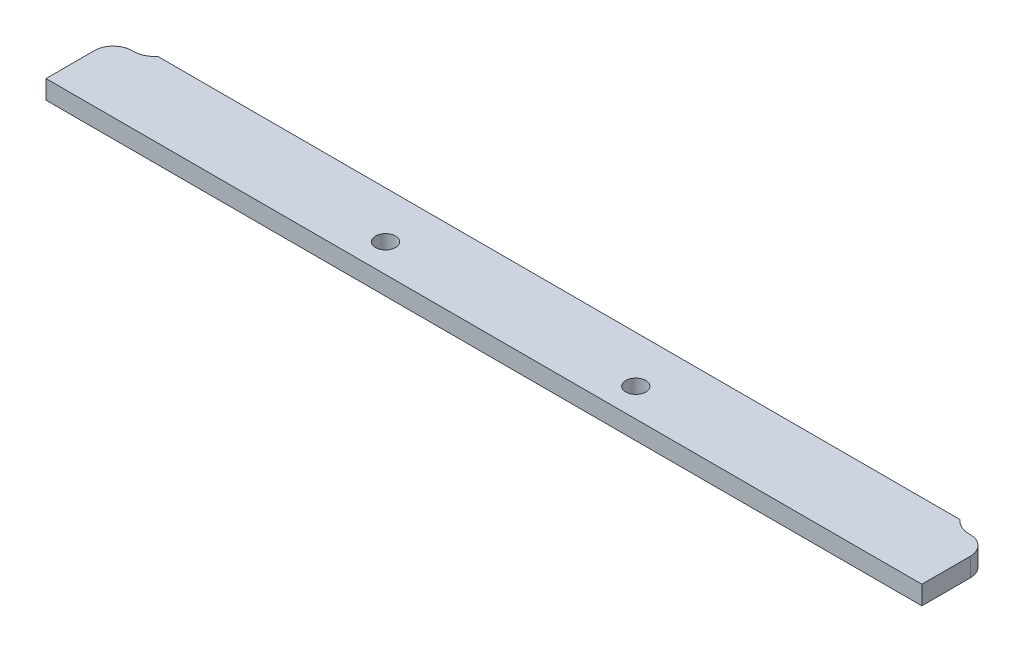
ISO-10303-21;
HEADER;
FILE_DESCRIPTION(('STEP AP214'),'2;1');
FILE_NAME('part.step','',(''),(''),'','','');
FILE_SCHEMA(('AUTOMOTIVE_DESIGN { 1 0 10303 214 1 1 1 1 }'));
ENDSEC;
DATA;
#1=APPLICATION_CONTEXT('core data for automotive mechanical design processes');
#2=APPLICATION_PROTOCOL_DEFINITION('international standard','automotive_design',2000,#1);
#3=PRODUCT_CONTEXT('',#1,'mechanical');
#4=PRODUCT('Part','Part','',(#3));
#5=PRODUCT_RELATED_PRODUCT_CATEGORY('part','',(#4));
#6=PRODUCT_DEFINITION_FORMATION('','',#4);
#7=PRODUCT_DEFINITION_CONTEXT('part definition',#1,'design');
#8=PRODUCT_DEFINITION('design','',#6,#7);
#9=PRODUCT_DEFINITION_SHAPE('','',#8);
#10=(LENGTH_UNIT() NAMED_UNIT(*) SI_UNIT(.MILLI.,.METRE.));
#11=(NAMED_UNIT(*) PLANE_ANGLE_UNIT() SI_UNIT($,.RADIAN.));
#12=(NAMED_UNIT(*) SI_UNIT($,.STERADIAN.) SOLID_ANGLE_UNIT());
#13=UNCERTAINTY_MEASURE_WITH_UNIT(LENGTH_MEASURE(1.E-05),#10,'distance_accuracy_value','');
#14=(GEOMETRIC_REPRESENTATION_CONTEXT(3) GLOBAL_UNCERTAINTY_ASSIGNED_CONTEXT((#13)) GLOBAL_UNIT_ASSIGNED_CONTEXT((#10,
#11,#12)) REPRESENTATION_CONTEXT('',''));
#15=CARTESIAN_POINT('',(0.,0.,0.));
#16=DIRECTION('',(0.,0.,1.));
#17=DIRECTION('',(1.,0.,0.));
#18=AXIS2_PLACEMENT_3D('',#15,#16,#17);
#19=CARTESIAN_POINT('',(-5.43102283706826,0.,-28.5998740388004));
#20=DIRECTION('',(0.,1.,0.));
#21=DIRECTION('',(0.,0.,1.));
#22=AXIS2_PLACEMENT_3D('',#19,#20,#21);
#23=PLANE('',#22);
#24=CARTESIAN_POINT('',(41.1097970990968,0.,-18.9031140667815));
#25=DIRECTION('',(0.,1.,0.));
#26=DIRECTION('',(0.,0.,1.));
#27=AXIS2_PLACEMENT_3D('',#24,#25,#26);
#28=CIRCLE('',#27,1.6);
#29=CARTESIAN_POINT('',(41.1097970990968,0.,-17.3031140667815));
#30=VERTEX_POINT('',#29);
#31=EDGE_CURVE('E254',#30,#30,#28,.F.);
#32=ORIENTED_EDGE('',*,*,#31,.F.);
#33=EDGE_LOOP('',(#32));
#34=FACE_BOUND('',#33,.T.);
#35=CARTESIAN_POINT('',(81.1097970990968,0.,-18.9031140667815));
#36=DIRECTION('',(0.,1.,0.));
#37=DIRECTION('',(0.,0.,1.));
#38=AXIS2_PLACEMENT_3D('',#35,#36,#37);
#39=CIRCLE('',#38,1.6);
#40=CARTESIAN_POINT('',(81.1097970990968,0.,-17.3031140667815));
#41=VERTEX_POINT('',#40);
#42=EDGE_CURVE('E271',#41,#41,#39,.F.);
#43=ORIENTED_EDGE('',*,*,#42,.F.);
#44=EDGE_LOOP('',(#43));
#45=FACE_BOUND('',#44,.T.);
#46=CARTESIAN_POINT('',(-5.43102283706826,0.,-28.5998740388004));
#47=DIRECTION('',(0.,-1.,0.));
#48=DIRECTION('',(0.,0.,1.));
#49=AXIS2_PLACEMENT_3D('',#46,#47,#48);
#50=CIRCLE('',#49,3.5);
#51=CARTESIAN_POINT('',(-2.74094444966359,0.,-26.3607942569216));
#52=VERTEX_POINT('',#51);
#53=CARTESIAN_POINT('',(-5.43102283706826,0.,-25.0998740388004));
#54=VERTEX_POINT('',#53);
#55=EDGE_CURVE('E154',#52,#54,#50,.T.);
#56=ORIENTED_EDGE('',*,*,#55,.F.);
#57=DIRECTION('',(-1.,0.,0.));
#58=VECTOR('',#57,1.);
#59=CARTESIAN_POINT('',(-2.74094444966359,0.,-26.3607942569216));
#60=LINE('',#59,#58);
#61=CARTESIAN_POINT('',(125.490280150114,0.,-26.3607942569216));
#62=VERTEX_POINT('',#61);
#63=EDGE_CURVE('E96',#62,#52,#60,.T.);
#64=ORIENTED_EDGE('',*,*,#63,.F.);
#65=CARTESIAN_POINT('',(128.180358537518,0.,-28.5998740388004));
#66=DIRECTION('',(0.,-1.,0.));
#67=DIRECTION('',(0.,0.,1.));
#68=AXIS2_PLACEMENT_3D('',#65,#66,#67);
#69=CIRCLE('',#68,3.5);
#70=CARTESIAN_POINT('',(128.180358537518,0.,-25.0998740388004));
#71=VERTEX_POINT('',#70);
#72=EDGE_CURVE('E171',#71,#62,#69,.T.);
#73=ORIENTED_EDGE('',*,*,#72,.F.);
#74=DIRECTION('',(-1.,0.,0.));
#75=VECTOR('',#74,1.);
#76=CARTESIAN_POINT('',(128.374667850225,0.,-25.0998740388004));
#77=LINE('',#76,#75);
#78=CARTESIAN_POINT('',(128.374667850225,0.,-25.0998740388004));
#79=VERTEX_POINT('',#78);
#80=EDGE_CURVE('E142',#79,#71,#77,.T.);
#81=ORIENTED_EDGE('',*,*,#80,.F.);
#82=CARTESIAN_POINT('',(128.374667850225,0.,-22.0998740388004));
#83=DIRECTION('',(0.,1.,0.));
#84=DIRECTION('',(0.,0.,1.));
#85=AXIS2_PLACEMENT_3D('',#82,#83,#84);
#86=CIRCLE('',#85,3.);
#87=CARTESIAN_POINT('',(131.374667850225,0.,-22.0998740388004));
#88=VERTEX_POINT('',#87);
#89=EDGE_CURVE('E168',#88,#79,#86,.T.);
#90=ORIENTED_EDGE('',*,*,#89,.F.);
#91=DIRECTION('',(0.,0.,-1.));
#92=VECTOR('',#91,1.);
#93=CARTESIAN_POINT('',(131.374667850225,0.,-22.0998740388004));
#94=LINE('',#93,#92);
#95=CARTESIAN_POINT('',(131.374667850225,0.,-14.3588941767466));
#96=VERTEX_POINT('',#95);
#97=EDGE_CURVE('E166',#96,#88,#94,.T.);
#98=ORIENTED_EDGE('',*,*,#97,.F.);
#99=DIRECTION('',(1.,0.,0.));
#100=VECTOR('',#99,1.);
#101=CARTESIAN_POINT('',(131.374667850225,0.,-14.3588941767466));
#102=LINE('',#101,#100);
#103=CARTESIAN_POINT('',(-8.62533214977497,0.,-14.3588941767466));
#104=VERTEX_POINT('',#103);
#105=EDGE_CURVE('E164',#104,#96,#102,.T.);
#106=ORIENTED_EDGE('',*,*,#105,.F.);
#107=DIRECTION('',(0.,0.,1.));
#108=VECTOR('',#107,1.);
#109=CARTESIAN_POINT('',(-8.62533214977497,0.,-14.3588941767466));
#110=LINE('',#109,#108);
#111=CARTESIAN_POINT('',(-8.62533214977497,0.,-22.0998740388004));
#112=VERTEX_POINT('',#111);
#113=EDGE_CURVE('E162',#112,#104,#110,.T.);
#114=ORIENTED_EDGE('',*,*,#113,.F.);
#115=CARTESIAN_POINT('',(-5.62533214977497,0.,-22.0998740388004));
#116=DIRECTION('',(0.,1.,0.));
#117=DIRECTION('',(0.,0.,1.));
#118=AXIS2_PLACEMENT_3D('',#115,#116,#117);
#119=CIRCLE('',#118,3.);
#120=CARTESIAN_POINT('',(-5.62533214977496,0.,-25.0998740388004));
#121=VERTEX_POINT('',#120);
#122=EDGE_CURVE('E160',#121,#112,#119,.T.);
#123=ORIENTED_EDGE('',*,*,#122,.F.);
#124=DIRECTION('',(-1.,0.,0.));
#125=VECTOR('',#124,1.);
#126=CARTESIAN_POINT('',(-5.43102283706826,0.,-25.0998740388004));
#127=LINE('',#126,#125);
#128=EDGE_CURVE('E157',#54,#121,#127,.T.);
#129=ORIENTED_EDGE('',*,*,#128,.F.);
#130=EDGE_LOOP('',(#56,#64,#73,#81,#90,#98,#106,#114,#123,#129));
#131=FACE_BOUND('',#130,.T.);
#132=DIRECTION('',(0.496686511837685,0.,0.867930013859708));
#133=VECTOR('',#132,1.);
#134=CARTESIAN_POINT('',(4.95214532790343,0.,-19.2323891613529));
#135=LINE('',#134,#133);
#136=CARTESIAN_POINT('',(4.95214532790343,0.,-19.2323891613529));
#137=VERTEX_POINT('',#136);
#138=CARTESIAN_POINT('',(5.15757401380086,0.,-18.8734148023786));
#139=VERTEX_POINT('',#138);
#140=EDGE_CURVE('E48',#137,#139,#135,.T.);
#141=ORIENTED_EDGE('',*,*,#140,.T.);
#142=DIRECTION('',(1.,0.,0.));
#143=VECTOR('',#142,1.);
#144=CARTESIAN_POINT('',(5.15757401380086,0.,-18.8734148023786));
#145=LINE('',#144,#143);
#146=CARTESIAN_POINT('',(5.80470943046753,0.,-18.8734148023786));
#147=VERTEX_POINT('',#146);
#148=EDGE_CURVE('E250',#139,#147,#145,.T.);
#149=ORIENTED_EDGE('',*,*,#148,.T.);
#150=DIRECTION('',(0.,0.,-1.));
#151=VECTOR('',#150,1.);
#152=CARTESIAN_POINT('',(5.80470943046753,0.,-18.8734148023786));
#153=LINE('',#152,#151);
#154=CARTESIAN_POINT('',(5.80470943046753,0.,-22.3734148023786));
#155=VERTEX_POINT('',#154);
#156=EDGE_CURVE('E247',#147,#155,#153,.T.);
#157=ORIENTED_EDGE('',*,*,#156,.T.);
#158=DIRECTION('',(-1.,0.,0.));
#159=VECTOR('',#158,1.);
#160=CARTESIAN_POINT('',(5.80470943046753,0.,-22.3734148023786));
#161=LINE('',#160,#159);
#162=CARTESIAN_POINT('',(5.49060686636496,0.,-22.3734148023786));
#163=VERTEX_POINT('',#162);
#164=EDGE_CURVE('E244',#155,#163,#161,.T.);
#165=ORIENTED_EDGE('',*,*,#164,.T.);
#166=DIRECTION('',(0.,0.,1.));
#167=VECTOR('',#166,1.);
#168=CARTESIAN_POINT('',(5.49060686636496,0.,-22.3734148023786));
#169=LINE('',#168,#167);
#170=CARTESIAN_POINT('',(5.49060686636496,0.,-19.2323891613529));
#171=VERTEX_POINT('',#170);
#172=EDGE_CURVE('E241',#163,#171,#169,.T.);
#173=ORIENTED_EDGE('',*,*,#172,.T.);
#174=DIRECTION('',(-1.,0.,0.));
#175=VECTOR('',#174,1.);
#176=CARTESIAN_POINT('',(5.49060686636496,0.,-19.2323891613529));
#177=LINE('',#176,#175);
#178=EDGE_CURVE('E237',#171,#137,#177,.T.);
#179=ORIENTED_EDGE('',*,*,#178,.T.);
#180=EDGE_LOOP('',(#141,#149,#157,#165,#173,#179));
#181=FACE_BOUND('',#180,.T.);
#182=ADVANCED_FACE('F33',(#34,#45,#131,#181),#23,.F.);
#183=CARTESIAN_POINT('',(-5.43102283706826,3.,-28.5998740388004));
#184=DIRECTION('',(0.,-1.,0.));
#185=DIRECTION('',(0.,0.,-1.));
#186=AXIS2_PLACEMENT_3D('',#183,#184,#185);
#187=CYLINDRICAL_SURFACE('',#186,3.5);
#188=ORIENTED_EDGE('',*,*,#55,.T.);
#189=DIRECTION('',(0.,-1.,0.));
#190=VECTOR('',#189,1.);
#191=CARTESIAN_POINT('',(-5.43102283706826,3.,-25.0998740388004));
#192=LINE('',#191,#190);
#193=CARTESIAN_POINT('',(-5.43102283706826,3.,-25.0998740388004));
#194=VERTEX_POINT('',#193);
#195=EDGE_CURVE('E11',#194,#54,#192,.T.);
#196=ORIENTED_EDGE('',*,*,#195,.F.);
#197=CARTESIAN_POINT('',(-5.43102283706826,3.,-28.5998740388004));
#198=DIRECTION('',(0.,-1.,0.));
#199=DIRECTION('',(0.,0.,1.));
#200=AXIS2_PLACEMENT_3D('',#197,#198,#199);
#201=CIRCLE('',#200,3.5);
#202=CARTESIAN_POINT('',(-2.74094444966359,3.,-26.3607942569216));
#203=VERTEX_POINT('',#202);
#204=EDGE_CURVE('E174',#203,#194,#201,.T.);
#205=ORIENTED_EDGE('',*,*,#204,.F.);
#206=DIRECTION('',(0.,-1.,0.));
#207=VECTOR('',#206,1.);
#208=CARTESIAN_POINT('',(-2.74094444966359,3.,-26.3607942569216));
#209=LINE('',#208,#207);
#210=EDGE_CURVE('E150',#203,#52,#209,.T.);
#211=ORIENTED_EDGE('',*,*,#210,.T.);
#212=EDGE_LOOP('',(#188,#196,#205,#211));
#213=FACE_BOUND('',#212,.T.);
#214=ADVANCED_FACE('F35',(#213),#187,.F.);
#215=CARTESIAN_POINT('',(-5.43102283706826,3.,-25.0998740388004));
#216=DIRECTION('',(0.,0.,1.));
#217=DIRECTION('',(1.,0.,0.));
#218=AXIS2_PLACEMENT_3D('',#215,#216,#217);
#219=PLANE('',#218);
#220=ORIENTED_EDGE('',*,*,#128,.T.);
#221=DIRECTION('',(0.,-1.,0.));
#222=VECTOR('',#221,1.);
#223=CARTESIAN_POINT('',(-5.62533214977496,3.,-25.0998740388004));
#224=LINE('',#223,#222);
#225=CARTESIAN_POINT('',(-5.62533214977496,3.,-25.0998740388004));
#226=VERTEX_POINT('',#225);
#227=EDGE_CURVE('E41',#226,#121,#224,.T.);
#228=ORIENTED_EDGE('',*,*,#227,.F.);
#229=DIRECTION('',(-1.,0.,0.));
#230=VECTOR('',#229,1.);
#231=CARTESIAN_POINT('',(-5.43102283706826,3.,-25.0998740388004));
#232=LINE('',#231,#230);
#233=EDGE_CURVE('E104',#194,#226,#232,.T.);
#234=ORIENTED_EDGE('',*,*,#233,.F.);
#235=ORIENTED_EDGE('',*,*,#195,.T.);
#236=EDGE_LOOP('',(#220,#228,#234,#235));
#237=FACE_BOUND('',#236,.T.);
#238=ADVANCED_FACE('F306',(#237),#219,.F.);
#239=CARTESIAN_POINT('',(-5.62533214977497,3.,-22.0998740388004));
#240=DIRECTION('',(0.,-1.,0.));
#241=DIRECTION('',(0.,0.,-1.));
#242=AXIS2_PLACEMENT_3D('',#239,#240,#241);
#243=CYLINDRICAL_SURFACE('',#242,3.);
#244=ORIENTED_EDGE('',*,*,#122,.T.);
#245=DIRECTION('',(0.,-1.,0.));
#246=VECTOR('',#245,1.);
#247=CARTESIAN_POINT('',(-8.62533214977497,3.,-22.0998740388004));
#248=LINE('',#247,#246);
#249=CARTESIAN_POINT('',(-8.62533214977497,3.,-22.0998740388004));
#250=VERTEX_POINT('',#249);
#251=EDGE_CURVE('E187',#250,#112,#248,.T.);
#252=ORIENTED_EDGE('',*,*,#251,.F.);
#253=CARTESIAN_POINT('',(-5.62533214977497,3.,-22.0998740388004));
#254=DIRECTION('',(0.,1.,0.));
#255=DIRECTION('',(0.,0.,1.));
#256=AXIS2_PLACEMENT_3D('',#253,#254,#255);
#257=CIRCLE('',#256,3.);
#258=EDGE_CURVE('E195',#226,#250,#257,.T.);
#259=ORIENTED_EDGE('',*,*,#258,.F.);
#260=ORIENTED_EDGE('',*,*,#227,.T.);
#261=EDGE_LOOP('',(#244,#252,#259,#260));
#262=FACE_BOUND('',#261,.T.);
#263=ADVANCED_FACE('F193',(#262),#243,.T.);
#264=CARTESIAN_POINT('',(-8.62533214977497,3.,-14.3588941767466));
#265=DIRECTION('',(1.,0.,0.));
#266=DIRECTION('',(0.,0.,-1.));
#267=AXIS2_PLACEMENT_3D('',#264,#265,#266);
#268=PLANE('',#267);
#269=ORIENTED_EDGE('',*,*,#113,.T.);
#270=DIRECTION('',(0.,-1.,0.));
#271=VECTOR('',#270,1.);
#272=CARTESIAN_POINT('',(-8.62533214977497,3.,-14.3588941767466));
#273=LINE('',#272,#271);
#274=CARTESIAN_POINT('',(-8.62533214977497,3.,-14.3588941767466));
#275=VERTEX_POINT('',#274);
#276=EDGE_CURVE('E184',#275,#104,#273,.T.);
#277=ORIENTED_EDGE('',*,*,#276,.F.);
#278=DIRECTION('',(0.,0.,1.));
#279=VECTOR('',#278,1.);
#280=CARTESIAN_POINT('',(-8.62533214977497,3.,-14.3588941767466));
#281=LINE('',#280,#279);
#282=EDGE_CURVE('E213',#250,#275,#281,.T.);
#283=ORIENTED_EDGE('',*,*,#282,.F.);
#284=ORIENTED_EDGE('',*,*,#251,.T.);
#285=EDGE_LOOP('',(#269,#277,#283,#284));
#286=FACE_BOUND('',#285,.T.);
#287=ADVANCED_FACE('F204',(#286),#268,.F.);
#288=CARTESIAN_POINT('',(131.374667850225,3.,-14.3588941767466));
#289=DIRECTION('',(0.,0.,-1.));
#290=DIRECTION('',(-1.,0.,0.));
#291=AXIS2_PLACEMENT_3D('',#288,#289,#290);
#292=PLANE('',#291);
#293=ORIENTED_EDGE('',*,*,#105,.T.);
#294=DIRECTION('',(0.,-1.,0.));
#295=VECTOR('',#294,1.);
#296=CARTESIAN_POINT('',(131.374667850225,3.,-14.3588941767466));
#297=LINE('',#296,#295);
#298=CARTESIAN_POINT('',(131.374667850225,3.,-14.3588941767466));
#299=VERTEX_POINT('',#298);
#300=EDGE_CURVE('E181',#299,#96,#297,.T.);
#301=ORIENTED_EDGE('',*,*,#300,.F.);
#302=DIRECTION('',(1.,0.,0.));
#303=VECTOR('',#302,1.);
#304=CARTESIAN_POINT('',(131.374667850225,3.,-14.3588941767466));
#305=LINE('',#304,#303);
#306=EDGE_CURVE('E210',#275,#299,#305,.T.);
#307=ORIENTED_EDGE('',*,*,#306,.F.);
#308=ORIENTED_EDGE('',*,*,#276,.T.);
#309=EDGE_LOOP('',(#293,#301,#307,#308));
#310=FACE_BOUND('',#309,.T.);
#311=ADVANCED_FACE('F208',(#310),#292,.F.);
#312=CARTESIAN_POINT('',(131.374667850225,3.,-22.0998740388004));
#313=DIRECTION('',(-1.,0.,0.));
#314=DIRECTION('',(0.,0.,1.));
#315=AXIS2_PLACEMENT_3D('',#312,#313,#314);
#316=PLANE('',#315);
#317=ORIENTED_EDGE('',*,*,#97,.T.);
#318=DIRECTION('',(0.,-1.,0.));
#319=VECTOR('',#318,1.);
#320=CARTESIAN_POINT('',(131.374667850225,3.,-22.0998740388004));
#321=LINE('',#320,#319);
#322=CARTESIAN_POINT('',(131.374667850225,3.,-22.0998740388004));
#323=VERTEX_POINT('',#322);
#324=EDGE_CURVE('E178',#323,#88,#321,.T.);
#325=ORIENTED_EDGE('',*,*,#324,.F.);
#326=DIRECTION('',(0.,0.,-1.));
#327=VECTOR('',#326,1.);
#328=CARTESIAN_POINT('',(131.374667850225,3.,-22.0998740388004));
#329=LINE('',#328,#327);
#330=EDGE_CURVE('E212',#299,#323,#329,.T.);
#331=ORIENTED_EDGE('',*,*,#330,.F.);
#332=ORIENTED_EDGE('',*,*,#300,.T.);
#333=EDGE_LOOP('',(#317,#325,#331,#332));
#334=FACE_BOUND('',#333,.T.);
#335=ADVANCED_FACE('F320',(#334),#316,.F.);
#336=CARTESIAN_POINT('',(128.374667850225,3.,-22.0998740388004));
#337=DIRECTION('',(0.,-1.,0.));
#338=DIRECTION('',(0.,0.,-1.));
#339=AXIS2_PLACEMENT_3D('',#336,#337,#338);
#340=CYLINDRICAL_SURFACE('',#339,3.);
#341=ORIENTED_EDGE('',*,*,#89,.T.);
#342=DIRECTION('',(0.,-1.,0.));
#343=VECTOR('',#342,1.);
#344=CARTESIAN_POINT('',(128.374667850225,3.,-25.0998740388004));
#345=LINE('',#344,#343);
#346=CARTESIAN_POINT('',(128.374667850225,3.,-25.0998740388004));
#347=VERTEX_POINT('',#346);
#348=EDGE_CURVE('E145',#347,#79,#345,.T.);
#349=ORIENTED_EDGE('',*,*,#348,.F.);
#350=CARTESIAN_POINT('',(128.374667850225,3.,-22.0998740388004));
#351=DIRECTION('',(0.,1.,0.));
#352=DIRECTION('',(0.,0.,1.));
#353=AXIS2_PLACEMENT_3D('',#350,#351,#352);
#354=CIRCLE('',#353,3.);
#355=EDGE_CURVE('E133',#323,#347,#354,.T.);
#356=ORIENTED_EDGE('',*,*,#355,.F.);
#357=ORIENTED_EDGE('',*,*,#324,.T.);
#358=EDGE_LOOP('',(#341,#349,#356,#357));
#359=FACE_BOUND('',#358,.T.);
#360=ADVANCED_FACE('F317',(#359),#340,.T.);
#361=CARTESIAN_POINT('',(128.374667850225,3.,-25.0998740388004));
#362=DIRECTION('',(0.,0.,1.));
#363=DIRECTION('',(1.,0.,0.));
#364=AXIS2_PLACEMENT_3D('',#361,#362,#363);
#365=PLANE('',#364);
#366=ORIENTED_EDGE('',*,*,#80,.T.);
#367=DIRECTION('',(0.,-1.,0.));
#368=VECTOR('',#367,1.);
#369=CARTESIAN_POINT('',(128.180358537518,3.,-25.0998740388004));
#370=LINE('',#369,#368);
#371=CARTESIAN_POINT('',(128.180358537518,3.,-25.0998740388004));
#372=VERTEX_POINT('',#371);
#373=EDGE_CURVE('E139',#372,#71,#370,.T.);
#374=ORIENTED_EDGE('',*,*,#373,.F.);
#375=DIRECTION('',(-1.,0.,0.));
#376=VECTOR('',#375,1.);
#377=CARTESIAN_POINT('',(128.374667850225,3.,-25.0998740388004));
#378=LINE('',#377,#376);
#379=EDGE_CURVE('E126',#347,#372,#378,.T.);
#380=ORIENTED_EDGE('',*,*,#379,.F.);
#381=ORIENTED_EDGE('',*,*,#348,.T.);
#382=EDGE_LOOP('',(#366,#374,#380,#381));
#383=FACE_BOUND('',#382,.T.);
#384=ADVANCED_FACE('F140',(#383),#365,.F.);
#385=CARTESIAN_POINT('',(128.180358537518,3.,-28.5998740388004));
#386=DIRECTION('',(0.,-1.,0.));
#387=DIRECTION('',(0.,0.,-1.));
#388=AXIS2_PLACEMENT_3D('',#385,#386,#387);
#389=CYLINDRICAL_SURFACE('',#388,3.5);
#390=ORIENTED_EDGE('',*,*,#72,.T.);
#391=DIRECTION('',(0.,-1.,0.));
#392=VECTOR('',#391,1.);
#393=CARTESIAN_POINT('',(125.490280150114,3.,-26.3607942569216));
#394=LINE('',#393,#392);
#395=CARTESIAN_POINT('',(125.490280150114,3.,-26.3607942569216));
#396=VERTEX_POINT('',#395);
#397=EDGE_CURVE('E146',#396,#62,#394,.T.);
#398=ORIENTED_EDGE('',*,*,#397,.F.);
#399=CARTESIAN_POINT('',(128.180358537518,3.,-28.5998740388004));
#400=DIRECTION('',(0.,-1.,0.));
#401=DIRECTION('',(0.,0.,1.));
#402=AXIS2_PLACEMENT_3D('',#399,#400,#401);
#403=CIRCLE('',#402,3.5);
#404=EDGE_CURVE('E130',#372,#396,#403,.T.);
#405=ORIENTED_EDGE('',*,*,#404,.F.);
#406=ORIENTED_EDGE('',*,*,#373,.T.);
#407=EDGE_LOOP('',(#390,#398,#405,#406));
#408=FACE_BOUND('',#407,.T.);
#409=ADVANCED_FACE('F148',(#408),#389,.F.);
#410=CARTESIAN_POINT('',(-2.74094444966359,3.,-26.3607942569216));
#411=DIRECTION('',(0.,0.,1.));
#412=DIRECTION('',(1.,0.,0.));
#413=AXIS2_PLACEMENT_3D('',#410,#411,#412);
#414=PLANE('',#413);
#415=ORIENTED_EDGE('',*,*,#63,.T.);
#416=ORIENTED_EDGE('',*,*,#210,.F.);
#417=DIRECTION('',(-1.,0.,0.));
#418=VECTOR('',#417,1.);
#419=CARTESIAN_POINT('',(-2.74094444966359,3.,-26.3607942569216));
#420=LINE('',#419,#418);
#421=EDGE_CURVE('E57',#396,#203,#420,.T.);
#422=ORIENTED_EDGE('',*,*,#421,.F.);
#423=ORIENTED_EDGE('',*,*,#397,.T.);
#424=EDGE_LOOP('',(#415,#416,#422,#423));
#425=FACE_BOUND('',#424,.T.);
#426=ADVANCED_FACE('F289',(#425),#414,.F.);
#427=CARTESIAN_POINT('',(-5.43102283706826,3.,-28.5998740388004));
#428=DIRECTION('',(0.,1.,0.));
#429=DIRECTION('',(0.,0.,1.));
#430=AXIS2_PLACEMENT_3D('',#427,#428,#429);
#431=PLANE('',#430);
#432=CARTESIAN_POINT('',(41.1097970990968,3.,-18.9031140667815));
#433=DIRECTION('',(0.,1.,0.));
#434=DIRECTION('',(0.,0.,1.));
#435=AXIS2_PLACEMENT_3D('',#432,#433,#434);
#436=CIRCLE('',#435,1.6);
#437=CARTESIAN_POINT('',(41.1097970990968,3.,-17.3031140667815));
#438=VERTEX_POINT('',#437);
#439=EDGE_CURVE('E274',#438,#438,#436,.T.);
#440=ORIENTED_EDGE('',*,*,#439,.F.);
#441=EDGE_LOOP('',(#440));
#442=FACE_BOUND('',#441,.T.);
#443=CARTESIAN_POINT('',(81.1097970990968,3.,-18.9031140667815));
#444=DIRECTION('',(0.,1.,0.));
#445=DIRECTION('',(0.,0.,1.));
#446=AXIS2_PLACEMENT_3D('',#443,#444,#445);
#447=CIRCLE('',#446,1.6);
#448=CARTESIAN_POINT('',(81.1097970990968,3.,-17.3031140667815));
#449=VERTEX_POINT('',#448);
#450=EDGE_CURVE('E275',#449,#449,#447,.T.);
#451=ORIENTED_EDGE('',*,*,#450,.F.);
#452=EDGE_LOOP('',(#451));
#453=FACE_BOUND('',#452,.T.);
#454=ORIENTED_EDGE('',*,*,#204,.T.);
#455=ORIENTED_EDGE('',*,*,#233,.T.);
#456=ORIENTED_EDGE('',*,*,#258,.T.);
#457=ORIENTED_EDGE('',*,*,#282,.T.);
#458=ORIENTED_EDGE('',*,*,#306,.T.);
#459=ORIENTED_EDGE('',*,*,#330,.T.);
#460=ORIENTED_EDGE('',*,*,#355,.T.);
#461=ORIENTED_EDGE('',*,*,#379,.T.);
#462=ORIENTED_EDGE('',*,*,#404,.T.);
#463=ORIENTED_EDGE('',*,*,#421,.T.);
#464=EDGE_LOOP('',(#454,#455,#456,#457,#458,#459,#460,#461,#462,#463));
#465=FACE_BOUND('',#464,.T.);
#466=ADVANCED_FACE('F128',(#442,#453,#465),#431,.T.);
#467=CARTESIAN_POINT('',(4.95214532790343,1.,-19.2323891613529));
#468=DIRECTION('',(0.867930013859708,0.,-0.496686511837685));
#469=DIRECTION('',(-0.496686511837685,0.,-0.867930013859708));
#470=AXIS2_PLACEMENT_3D('',#467,#468,#469);
#471=PLANE('',#470);
#472=ORIENTED_EDGE('',*,*,#140,.F.);
#473=DIRECTION('',(0.,-1.,0.));
#474=VECTOR('',#473,1.);
#475=CARTESIAN_POINT('',(4.95214532790343,1.,-19.2323891613529));
#476=LINE('',#475,#474);
#477=CARTESIAN_POINT('',(4.95214532790343,1.,-19.2323891613529));
#478=VERTEX_POINT('',#477);
#479=EDGE_CURVE('E234',#478,#137,#476,.T.);
#480=ORIENTED_EDGE('',*,*,#479,.F.);
#481=DIRECTION('',(0.496686511837685,0.,0.867930013859708));
#482=VECTOR('',#481,1.);
#483=CARTESIAN_POINT('',(4.95214532790343,1.,-19.2323891613529));
#484=LINE('',#483,#482);
#485=CARTESIAN_POINT('',(5.15757401380086,1.,-18.8734148023786));
#486=VERTEX_POINT('',#485);
#487=EDGE_CURVE('E240',#478,#486,#484,.T.);
#488=ORIENTED_EDGE('',*,*,#487,.T.);
#489=DIRECTION('',(0.,-1.,0.));
#490=VECTOR('',#489,1.);
#491=CARTESIAN_POINT('',(5.15757401380086,1.,-18.8734148023786));
#492=LINE('',#491,#490);
#493=EDGE_CURVE('E158',#486,#139,#492,.T.);
#494=ORIENTED_EDGE('',*,*,#493,.T.);
#495=EDGE_LOOP('',(#472,#480,#488,#494));
#496=FACE_BOUND('',#495,.T.);
#497=ADVANCED_FACE('F288',(#496),#471,.T.);
#498=CARTESIAN_POINT('',(5.15757401380086,1.,-18.8734148023786));
#499=DIRECTION('',(0.,0.,-1.));
#500=DIRECTION('',(-1.,0.,0.));
#501=AXIS2_PLACEMENT_3D('',#498,#499,#500);
#502=PLANE('',#501);
#503=ORIENTED_EDGE('',*,*,#148,.F.);
#504=ORIENTED_EDGE('',*,*,#493,.F.);
#505=DIRECTION('',(1.,0.,0.));
#506=VECTOR('',#505,1.);
#507=CARTESIAN_POINT('',(5.15757401380086,1.,-18.8734148023786));
#508=LINE('',#507,#506);
#509=CARTESIAN_POINT('',(5.80470943046753,1.,-18.8734148023786));
#510=VERTEX_POINT('',#509);
#511=EDGE_CURVE('E266',#486,#510,#508,.T.);
#512=ORIENTED_EDGE('',*,*,#511,.T.);
#513=DIRECTION('',(0.,-1.,0.));
#514=VECTOR('',#513,1.);
#515=CARTESIAN_POINT('',(5.80470943046753,1.,-18.8734148023786));
#516=LINE('',#515,#514);
#517=EDGE_CURVE('E222',#510,#147,#516,.T.);
#518=ORIENTED_EDGE('',*,*,#517,.T.);
#519=EDGE_LOOP('',(#503,#504,#512,#518));
#520=FACE_BOUND('',#519,.T.);
#521=ADVANCED_FACE('F382',(#520),#502,.T.);
#522=CARTESIAN_POINT('',(5.80470943046753,1.,-18.8734148023786));
#523=DIRECTION('',(-1.,0.,0.));
#524=DIRECTION('',(0.,0.,1.));
#525=AXIS2_PLACEMENT_3D('',#522,#523,#524);
#526=PLANE('',#525);
#527=ORIENTED_EDGE('',*,*,#156,.F.);
#528=ORIENTED_EDGE('',*,*,#517,.F.);
#529=DIRECTION('',(0.,0.,-1.));
#530=VECTOR('',#529,1.);
#531=CARTESIAN_POINT('',(5.80470943046753,1.,-18.8734148023786));
#532=LINE('',#531,#530);
#533=CARTESIAN_POINT('',(5.80470943046753,1.,-22.3734148023786));
#534=VERTEX_POINT('',#533);
#535=EDGE_CURVE('E263',#510,#534,#532,.T.);
#536=ORIENTED_EDGE('',*,*,#535,.T.);
#537=DIRECTION('',(0.,-1.,0.));
#538=VECTOR('',#537,1.);
#539=CARTESIAN_POINT('',(5.80470943046753,1.,-22.3734148023786));
#540=LINE('',#539,#538);
#541=EDGE_CURVE('E225',#534,#155,#540,.T.);
#542=ORIENTED_EDGE('',*,*,#541,.T.);
#543=EDGE_LOOP('',(#527,#528,#536,#542));
#544=FACE_BOUND('',#543,.T.);
#545=ADVANCED_FACE('F388',(#544),#526,.T.);
#546=CARTESIAN_POINT('',(5.80470943046753,1.,-22.3734148023786));
#547=DIRECTION('',(0.,0.,1.));
#548=DIRECTION('',(1.,0.,0.));
#549=AXIS2_PLACEMENT_3D('',#546,#547,#548);
#550=PLANE('',#549);
#551=ORIENTED_EDGE('',*,*,#164,.F.);
#552=ORIENTED_EDGE('',*,*,#541,.F.);
#553=DIRECTION('',(-1.,0.,0.));
#554=VECTOR('',#553,1.);
#555=CARTESIAN_POINT('',(5.80470943046753,1.,-22.3734148023786));
#556=LINE('',#555,#554);
#557=CARTESIAN_POINT('',(5.49060686636496,1.,-22.3734148023786));
#558=VERTEX_POINT('',#557);
#559=EDGE_CURVE('E260',#534,#558,#556,.T.);
#560=ORIENTED_EDGE('',*,*,#559,.T.);
#561=DIRECTION('',(0.,-1.,0.));
#562=VECTOR('',#561,1.);
#563=CARTESIAN_POINT('',(5.49060686636496,1.,-22.3734148023786));
#564=LINE('',#563,#562);
#565=EDGE_CURVE('E228',#558,#163,#564,.T.);
#566=ORIENTED_EDGE('',*,*,#565,.T.);
#567=EDGE_LOOP('',(#551,#552,#560,#566));
#568=FACE_BOUND('',#567,.T.);
#569=ADVANCED_FACE('F396',(#568),#550,.T.);
#570=CARTESIAN_POINT('',(5.49060686636496,1.,-22.3734148023786));
#571=DIRECTION('',(1.,0.,0.));
#572=DIRECTION('',(0.,0.,-1.));
#573=AXIS2_PLACEMENT_3D('',#570,#571,#572);
#574=PLANE('',#573);
#575=ORIENTED_EDGE('',*,*,#172,.F.);
#576=ORIENTED_EDGE('',*,*,#565,.F.);
#577=DIRECTION('',(0.,0.,1.));
#578=VECTOR('',#577,1.);
#579=CARTESIAN_POINT('',(5.49060686636496,1.,-22.3734148023786));
#580=LINE('',#579,#578);
#581=CARTESIAN_POINT('',(5.49060686636496,1.,-19.2323891613529));
#582=VERTEX_POINT('',#581);
#583=EDGE_CURVE('E257',#558,#582,#580,.T.);
#584=ORIENTED_EDGE('',*,*,#583,.T.);
#585=DIRECTION('',(0.,-1.,0.));
#586=VECTOR('',#585,1.);
#587=CARTESIAN_POINT('',(5.49060686636496,1.,-19.2323891613529));
#588=LINE('',#587,#586);
#589=EDGE_CURVE('E231',#582,#171,#588,.T.);
#590=ORIENTED_EDGE('',*,*,#589,.T.);
#591=EDGE_LOOP('',(#575,#576,#584,#590));
#592=FACE_BOUND('',#591,.T.);
#593=ADVANCED_FACE('F404',(#592),#574,.T.);
#594=CARTESIAN_POINT('',(5.49060686636496,1.,-19.2323891613529));
#595=DIRECTION('',(0.,0.,1.));
#596=DIRECTION('',(1.,0.,0.));
#597=AXIS2_PLACEMENT_3D('',#594,#595,#596);
#598=PLANE('',#597);
#599=ORIENTED_EDGE('',*,*,#178,.F.);
#600=ORIENTED_EDGE('',*,*,#589,.F.);
#601=DIRECTION('',(-1.,0.,0.));
#602=VECTOR('',#601,1.);
#603=CARTESIAN_POINT('',(5.49060686636496,1.,-19.2323891613529));
#604=LINE('',#603,#602);
#605=EDGE_CURVE('E236',#582,#478,#604,.T.);
#606=ORIENTED_EDGE('',*,*,#605,.T.);
#607=ORIENTED_EDGE('',*,*,#479,.T.);
#608=EDGE_LOOP('',(#599,#600,#606,#607));
#609=FACE_BOUND('',#608,.T.);
#610=ADVANCED_FACE('F412',(#609),#598,.T.);
#611=CARTESIAN_POINT('',(0.,1.,0.));
#612=DIRECTION('',(0.,1.,0.));
#613=DIRECTION('',(0.,0.,1.));
#614=AXIS2_PLACEMENT_3D('',#611,#612,#613);
#615=PLANE('',#614);
#616=ORIENTED_EDGE('',*,*,#487,.F.);
#617=ORIENTED_EDGE('',*,*,#605,.F.);
#618=ORIENTED_EDGE('',*,*,#583,.F.);
#619=ORIENTED_EDGE('',*,*,#559,.F.);
#620=ORIENTED_EDGE('',*,*,#535,.F.);
#621=ORIENTED_EDGE('',*,*,#511,.F.);
#622=EDGE_LOOP('',(#616,#617,#618,#619,#620,#621));
#623=FACE_BOUND('',#622,.T.);
#624=ADVANCED_FACE('F296',(#623),#615,.F.);
#625=CARTESIAN_POINT('',(81.1097970990968,-0.00100000000000013,-18.9031140667815));
#626=DIRECTION('',(0.,1.,0.));
#627=DIRECTION('',(0.,0.,1.));
#628=AXIS2_PLACEMENT_3D('',#625,#626,#627);
#629=CYLINDRICAL_SURFACE('',#628,1.6);
#630=CARTESIAN_POINT('',(81.1097970990968,3.,-17.3031140667815));
#631=CARTESIAN_POINT('',(81.1097970990968,2.96875,-17.3031140667815));
#632=CARTESIAN_POINT('',(81.1097970990968,2.9375,-17.3031140667815));
#633=CARTESIAN_POINT('',(81.1097970990968,2.875,-17.3031140667815));
#634=CARTESIAN_POINT('',(81.1097970990968,2.84375,-17.3031140667815));
#635=CARTESIAN_POINT('',(81.1097970990968,2.78125,-17.3031140667815));
#636=CARTESIAN_POINT('',(81.1097970990968,2.75,-17.3031140667815));
#637=CARTESIAN_POINT('',(81.1097970990968,2.6875,-17.3031140667815));
#638=CARTESIAN_POINT('',(81.1097970990968,2.65625,-17.3031140667815));
#639=CARTESIAN_POINT('',(81.1097970990968,2.59375,-17.3031140667815));
#640=CARTESIAN_POINT('',(81.1097970990968,2.5625,-17.3031140667815));
#641=CARTESIAN_POINT('',(81.1097970990968,2.5,-17.3031140667815));
#642=CARTESIAN_POINT('',(81.1097970990968,2.46875,-17.3031140667815));
#643=CARTESIAN_POINT('',(81.1097970990968,2.40625,-17.3031140667815));
#644=CARTESIAN_POINT('',(81.1097970990968,2.375,-17.3031140667815));
#645=CARTESIAN_POINT('',(81.1097970990968,2.3125,-17.3031140667815));
#646=CARTESIAN_POINT('',(81.1097970990968,2.28125,-17.3031140667815));
#647=CARTESIAN_POINT('',(81.1097970990968,2.21875,-17.3031140667815));
#648=CARTESIAN_POINT('',(81.1097970990968,2.1875,-17.3031140667815));
#649=CARTESIAN_POINT('',(81.1097970990968,2.125,-17.3031140667815));
#650=CARTESIAN_POINT('',(81.1097970990968,2.09375,-17.3031140667815));
#651=CARTESIAN_POINT('',(81.1097970990968,2.03125,-17.3031140667815));
#652=CARTESIAN_POINT('',(81.1097970990968,2.,-17.3031140667815));
#653=CARTESIAN_POINT('',(81.1097970990968,1.9375,-17.3031140667815));
#654=CARTESIAN_POINT('',(81.1097970990968,1.90625,-17.3031140667815));
#655=CARTESIAN_POINT('',(81.1097970990968,1.84375,-17.3031140667815));
#656=CARTESIAN_POINT('',(81.1097970990968,1.8125,-17.3031140667815));
#657=CARTESIAN_POINT('',(81.1097970990968,1.75,-17.3031140667815));
#658=CARTESIAN_POINT('',(81.1097970990968,1.71875,-17.3031140667815));
#659=CARTESIAN_POINT('',(81.1097970990968,1.65625,-17.3031140667815));
#660=CARTESIAN_POINT('',(81.1097970990968,1.625,-17.3031140667815));
#661=CARTESIAN_POINT('',(81.1097970990968,1.5625,-17.3031140667815));
#662=CARTESIAN_POINT('',(81.1097970990968,1.53125,-17.3031140667815));
#663=CARTESIAN_POINT('',(81.1097970990968,1.46875,-17.3031140667815));
#664=CARTESIAN_POINT('',(81.1097970990968,1.4375,-17.3031140667815));
#665=CARTESIAN_POINT('',(81.1097970990968,1.375,-17.3031140667815));
#666=CARTESIAN_POINT('',(81.1097970990968,1.34375,-17.3031140667815));
#667=CARTESIAN_POINT('',(81.1097970990968,1.28125,-17.3031140667815));
#668=CARTESIAN_POINT('',(81.1097970990968,1.25,-17.3031140667815));
#669=CARTESIAN_POINT('',(81.1097970990968,1.1875,-17.3031140667815));
#670=CARTESIAN_POINT('',(81.1097970990968,1.15625,-17.3031140667815));
#671=CARTESIAN_POINT('',(81.1097970990968,1.09375,-17.3031140667815));
#672=CARTESIAN_POINT('',(81.1097970990968,1.0625,-17.3031140667815));
#673=CARTESIAN_POINT('',(81.1097970990968,1.,-17.3031140667815));
#674=CARTESIAN_POINT('',(81.1097970990968,0.96875,-17.3031140667815));
#675=CARTESIAN_POINT('',(81.1097970990968,0.90625,-17.3031140667815));
#676=CARTESIAN_POINT('',(81.1097970990968,0.875,-17.3031140667815));
#677=CARTESIAN_POINT('',(81.1097970990968,0.8125,-17.3031140667815));
#678=CARTESIAN_POINT('',(81.1097970990968,0.78125,-17.3031140667815));
#679=CARTESIAN_POINT('',(81.1097970990968,0.71875,-17.3031140667815));
#680=CARTESIAN_POINT('',(81.1097970990968,0.6875,-17.3031140667815));
#681=CARTESIAN_POINT('',(81.1097970990968,0.625,-17.3031140667815));
#682=CARTESIAN_POINT('',(81.1097970990968,0.59375,-17.3031140667815));
#683=CARTESIAN_POINT('',(81.1097970990968,0.53125,-17.3031140667815));
#684=CARTESIAN_POINT('',(81.1097970990968,0.5,-17.3031140667815));
#685=CARTESIAN_POINT('',(81.1097970990968,0.4375,-17.3031140667815));
#686=CARTESIAN_POINT('',(81.1097970990968,0.40625,-17.3031140667815));
#687=CARTESIAN_POINT('',(81.1097970990968,0.34375,-17.3031140667815));
#688=CARTESIAN_POINT('',(81.1097970990968,0.3125,-17.3031140667815));
#689=CARTESIAN_POINT('',(81.1097970990968,0.25,-17.3031140667815));
#690=CARTESIAN_POINT('',(81.1097970990968,0.21875,-17.3031140667815));
#691=CARTESIAN_POINT('',(81.1097970990968,0.15625,-17.3031140667815));
#692=CARTESIAN_POINT('',(81.1097970990968,0.125,-17.3031140667815));
#693=CARTESIAN_POINT('',(81.1097970990968,0.0625000000000001,-17.3031140667815));
#694=CARTESIAN_POINT('',(81.1097970990968,0.0312500000000001,-17.3031140667815));
#695=CARTESIAN_POINT('',(81.1097970990968,0.,-17.3031140667815));
#696=B_SPLINE_CURVE_WITH_KNOTS('',3,(#630,#631,#632,#633,#634,#635,#636,#637,#638,#639,#640,
#641,#642,#643,#644,#645,#646,#647,#648,#649,#650,#651,#652,#653,#654,#655,#656,#657,#658,#659,
#660,#661,#662,#663,#664,#665,#666,#667,#668,#669,#670,#671,#672,#673,#674,#675,#676,#677,#678,
#679,#680,#681,#682,#683,#684,#685,#686,#687,#688,#689,#690,#691,#692,#693,#694,#695),
.UNSPECIFIED.,.F.,.F.,(4,2,2,2,2,2,2,2,2,2,2,2,2,2,2,2,2,2,2,2,2,2,2,2,2,2,2,2,2,2,2,2,4),(0.,
0.0937500000000001,0.1875,0.28125,0.375,0.46875,0.5625,0.65625,0.75,0.84375,0.9375,1.03125,
1.125,1.21875,1.3125,1.40625,1.5,1.59375,1.6875,1.78125,1.875,1.96875,2.0625,2.15625,2.25,
2.34375,2.4375,2.53125,2.625,2.71875,2.8125,2.90625,3.),.UNSPECIFIED.);
#697=EDGE_CURVE('BSEAM293',#449,#41,#696,.T.);
#698=ORIENTED_EDGE('',*,*,#450,.T.);
#699=ORIENTED_EDGE('',*,*,#42,.T.);
#700=ORIENTED_EDGE('',*,*,#697,.T.);
#701=ORIENTED_EDGE('',*,*,#697,.F.);
#702=EDGE_LOOP('',(#698,#700,#699,#701));
#703=FACE_BOUND('',#702,.T.);
#704=ADVANCED_FACE('F293',(#703),#629,.F.);
#705=CARTESIAN_POINT('',(41.1097970990968,-0.00100000000000013,-18.9031140667815));
#706=DIRECTION('',(0.,1.,0.));
#707=DIRECTION('',(0.,0.,1.));
#708=AXIS2_PLACEMENT_3D('',#705,#706,#707);
#709=CYLINDRICAL_SURFACE('',#708,1.6);
#710=CARTESIAN_POINT('',(41.1097970990968,3.,-17.3031140667815));
#711=CARTESIAN_POINT('',(41.1097970990968,2.96875,-17.3031140667815));
#712=CARTESIAN_POINT('',(41.1097970990968,2.9375,-17.3031140667815));
#713=CARTESIAN_POINT('',(41.1097970990968,2.875,-17.3031140667815));
#714=CARTESIAN_POINT('',(41.1097970990968,2.84375,-17.3031140667815));
#715=CARTESIAN_POINT('',(41.1097970990968,2.78125,-17.3031140667815));
#716=CARTESIAN_POINT('',(41.1097970990968,2.75,-17.3031140667815));
#717=CARTESIAN_POINT('',(41.1097970990968,2.6875,-17.3031140667815));
#718=CARTESIAN_POINT('',(41.1097970990968,2.65625,-17.3031140667815));
#719=CARTESIAN_POINT('',(41.1097970990968,2.59375,-17.3031140667815));
#720=CARTESIAN_POINT('',(41.1097970990968,2.5625,-17.3031140667815));
#721=CARTESIAN_POINT('',(41.1097970990968,2.5,-17.3031140667815));
#722=CARTESIAN_POINT('',(41.1097970990968,2.46875,-17.3031140667815));
#723=CARTESIAN_POINT('',(41.1097970990968,2.40625,-17.3031140667815));
#724=CARTESIAN_POINT('',(41.1097970990968,2.375,-17.3031140667815));
#725=CARTESIAN_POINT('',(41.1097970990968,2.3125,-17.3031140667815));
#726=CARTESIAN_POINT('',(41.1097970990968,2.28125,-17.3031140667815));
#727=CARTESIAN_POINT('',(41.1097970990968,2.21875,-17.3031140667815));
#728=CARTESIAN_POINT('',(41.1097970990968,2.1875,-17.3031140667815));
#729=CARTESIAN_POINT('',(41.1097970990968,2.125,-17.3031140667815));
#730=CARTESIAN_POINT('',(41.1097970990968,2.09375,-17.3031140667815));
#731=CARTESIAN_POINT('',(41.1097970990968,2.03125,-17.3031140667815));
#732=CARTESIAN_POINT('',(41.1097970990968,2.,-17.3031140667815));
#733=CARTESIAN_POINT('',(41.1097970990968,1.9375,-17.3031140667815));
#734=CARTESIAN_POINT('',(41.1097970990968,1.90625,-17.3031140667815));
#735=CARTESIAN_POINT('',(41.1097970990968,1.84375,-17.3031140667815));
#736=CARTESIAN_POINT('',(41.1097970990968,1.8125,-17.3031140667815));
#737=CARTESIAN_POINT('',(41.1097970990968,1.75,-17.3031140667815));
#738=CARTESIAN_POINT('',(41.1097970990968,1.71875,-17.3031140667815));
#739=CARTESIAN_POINT('',(41.1097970990968,1.65625,-17.3031140667815));
#740=CARTESIAN_POINT('',(41.1097970990968,1.625,-17.3031140667815));
#741=CARTESIAN_POINT('',(41.1097970990968,1.5625,-17.3031140667815));
#742=CARTESIAN_POINT('',(41.1097970990968,1.53125,-17.3031140667815));
#743=CARTESIAN_POINT('',(41.1097970990968,1.46875,-17.3031140667815));
#744=CARTESIAN_POINT('',(41.1097970990968,1.4375,-17.3031140667815));
#745=CARTESIAN_POINT('',(41.1097970990968,1.375,-17.3031140667815));
#746=CARTESIAN_POINT('',(41.1097970990968,1.34375,-17.3031140667815));
#747=CARTESIAN_POINT('',(41.1097970990968,1.28125,-17.3031140667815));
#748=CARTESIAN_POINT('',(41.1097970990968,1.25,-17.3031140667815));
#749=CARTESIAN_POINT('',(41.1097970990968,1.1875,-17.3031140667815));
#750=CARTESIAN_POINT('',(41.1097970990968,1.15625,-17.3031140667815));
#751=CARTESIAN_POINT('',(41.1097970990968,1.09375,-17.3031140667815));
#752=CARTESIAN_POINT('',(41.1097970990968,1.0625,-17.3031140667815));
#753=CARTESIAN_POINT('',(41.1097970990968,1.,-17.3031140667815));
#754=CARTESIAN_POINT('',(41.1097970990968,0.96875,-17.3031140667815));
#755=CARTESIAN_POINT('',(41.1097970990968,0.90625,-17.3031140667815));
#756=CARTESIAN_POINT('',(41.1097970990968,0.875,-17.3031140667815));
#757=CARTESIAN_POINT('',(41.1097970990968,0.8125,-17.3031140667815));
#758=CARTESIAN_POINT('',(41.1097970990968,0.78125,-17.3031140667815));
#759=CARTESIAN_POINT('',(41.1097970990968,0.71875,-17.3031140667815));
#760=CARTESIAN_POINT('',(41.1097970990968,0.6875,-17.3031140667815));
#761=CARTESIAN_POINT('',(41.1097970990968,0.625,-17.3031140667815));
#762=CARTESIAN_POINT('',(41.1097970990968,0.59375,-17.3031140667815));
#763=CARTESIAN_POINT('',(41.1097970990968,0.53125,-17.3031140667815));
#764=CARTESIAN_POINT('',(41.1097970990968,0.5,-17.3031140667815));
#765=CARTESIAN_POINT('',(41.1097970990968,0.4375,-17.3031140667815));
#766=CARTESIAN_POINT('',(41.1097970990968,0.40625,-17.3031140667815));
#767=CARTESIAN_POINT('',(41.1097970990968,0.34375,-17.3031140667815));
#768=CARTESIAN_POINT('',(41.1097970990968,0.3125,-17.3031140667815));
#769=CARTESIAN_POINT('',(41.1097970990968,0.25,-17.3031140667815));
#770=CARTESIAN_POINT('',(41.1097970990968,0.21875,-17.3031140667815));
#771=CARTESIAN_POINT('',(41.1097970990968,0.15625,-17.3031140667815));
#772=CARTESIAN_POINT('',(41.1097970990968,0.125,-17.3031140667815));
#773=CARTESIAN_POINT('',(41.1097970990968,0.0625000000000001,-17.3031140667815));
#774=CARTESIAN_POINT('',(41.1097970990968,0.0312500000000001,-17.3031140667815));
#775=CARTESIAN_POINT('',(41.1097970990968,0.,-17.3031140667815));
#776=B_SPLINE_CURVE_WITH_KNOTS('',3,(#710,#711,#712,#713,#714,#715,#716,#717,#718,#719,#720,
#721,#722,#723,#724,#725,#726,#727,#728,#729,#730,#731,#732,#733,#734,#735,#736,#737,#738,#739,
#740,#741,#742,#743,#744,#745,#746,#747,#748,#749,#750,#751,#752,#753,#754,#755,#756,#757,#758,
#759,#760,#761,#762,#763,#764,#765,#766,#767,#768,#769,#770,#771,#772,#773,#774,#775),
.UNSPECIFIED.,.F.,.F.,(4,2,2,2,2,2,2,2,2,2,2,2,2,2,2,2,2,2,2,2,2,2,2,2,2,2,2,2,2,2,2,2,4),(0.,
0.0937500000000001,0.1875,0.28125,0.375,0.46875,0.5625,0.65625,0.75,0.84375,0.9375,1.03125,
1.125,1.21875,1.3125,1.40625,1.5,1.59375,1.6875,1.78125,1.875,1.96875,2.0625,2.15625,2.25,
2.34375,2.4375,2.53125,2.625,2.71875,2.8125,2.90625,3.),.UNSPECIFIED.);
#777=EDGE_CURVE('BSEAM283',#438,#30,#776,.T.);
#778=ORIENTED_EDGE('',*,*,#439,.T.);
#779=ORIENTED_EDGE('',*,*,#31,.T.);
#780=ORIENTED_EDGE('',*,*,#777,.T.);
#781=ORIENTED_EDGE('',*,*,#777,.F.);
#782=EDGE_LOOP('',(#778,#780,#779,#781));
#783=FACE_BOUND('',#782,.T.);
#784=ADVANCED_FACE('F283',(#783),#709,.F.);
#785=CLOSED_SHELL('',(#182,#214,#238,#263,#287,#311,#335,#360,#384,#409,#426,#466,#497,#521,
#545,#569,#593,#610,#624,#704,#784));
#786=MANIFOLD_SOLID_BREP('B2',#785);
#787=ADVANCED_BREP_SHAPE_REPRESENTATION('',(#18,#786),#14);
#788=SHAPE_DEFINITION_REPRESENTATION(#9,#787);
ENDSEC;
END-ISO-10303-21;
